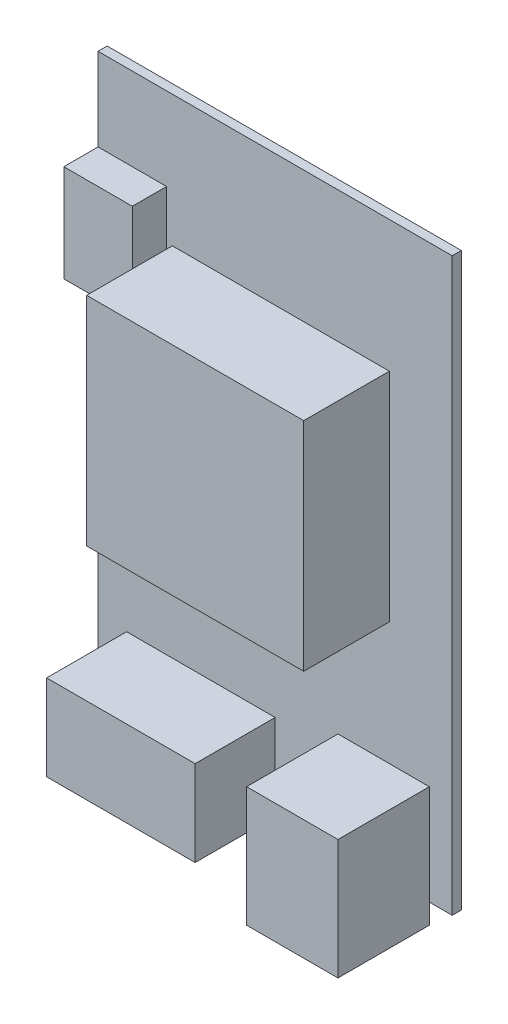
ISO-10303-21;
HEADER;
FILE_DESCRIPTION(('STEP AP214'),'2;1');
FILE_NAME('part.step','',(''),(''),'','','');
FILE_SCHEMA(('AUTOMOTIVE_DESIGN { 1 0 10303 214 1 1 1 1 }'));
ENDSEC;
DATA;
#1=APPLICATION_CONTEXT('core data for automotive mechanical design processes');
#2=APPLICATION_PROTOCOL_DEFINITION('international standard','automotive_design',2000,#1);
#3=PRODUCT_CONTEXT('',#1,'mechanical');
#4=PRODUCT('Part','Part','',(#3));
#5=PRODUCT_RELATED_PRODUCT_CATEGORY('part','',(#4));
#6=PRODUCT_DEFINITION_FORMATION('','',#4);
#7=PRODUCT_DEFINITION_CONTEXT('part definition',#1,'design');
#8=PRODUCT_DEFINITION('design','',#6,#7);
#9=PRODUCT_DEFINITION_SHAPE('','',#8);
#10=(LENGTH_UNIT() NAMED_UNIT(*) SI_UNIT(.MILLI.,.METRE.));
#11=(NAMED_UNIT(*) PLANE_ANGLE_UNIT() SI_UNIT($,.RADIAN.));
#12=(NAMED_UNIT(*) SI_UNIT($,.STERADIAN.) SOLID_ANGLE_UNIT());
#13=UNCERTAINTY_MEASURE_WITH_UNIT(LENGTH_MEASURE(1.E-05),#10,'distance_accuracy_value','');
#14=(GEOMETRIC_REPRESENTATION_CONTEXT(3) GLOBAL_UNCERTAINTY_ASSIGNED_CONTEXT((#13)) GLOBAL_UNIT_ASSIGNED_CONTEXT((#10,
#11,#12)) REPRESENTATION_CONTEXT('',''));
#15=CARTESIAN_POINT('',(0.,0.,0.));
#16=DIRECTION('',(0.,0.,1.));
#17=DIRECTION('',(1.,0.,0.));
#18=AXIS2_PLACEMENT_3D('',#15,#16,#17);
#19=CARTESIAN_POINT('',(0.,0.,1.6));
#20=DIRECTION('',(0.,0.,1.));
#21=DIRECTION('',(1.,0.,0.));
#22=AXIS2_PLACEMENT_3D('',#19,#20,#21);
#23=PLANE('',#22);
#24=DIRECTION('',(0.,1.,0.));
#25=VECTOR('',#24,1.);
#26=CARTESIAN_POINT('',(-19.,18.5,1.6));
#27=LINE('',#26,#25);
#28=CARTESIAN_POINT('',(-19.,18.5,1.6));
#29=VERTEX_POINT('',#28);
#30=CARTESIAN_POINT('',(-19.,35.5,1.6));
#31=VERTEX_POINT('',#30);
#32=EDGE_CURVE('E64',#29,#31,#27,.T.);
#33=ORIENTED_EDGE('',*,*,#32,.F.);
#34=DIRECTION('',(1.,0.,0.));
#35=VECTOR('',#34,1.);
#36=CARTESIAN_POINT('',(-31.,18.5,1.6));
#37=LINE('',#36,#35);
#38=CARTESIAN_POINT('',(-31.,18.5,1.6));
#39=VERTEX_POINT('',#38);
#40=EDGE_CURVE('E216',#39,#29,#37,.T.);
#41=ORIENTED_EDGE('',*,*,#40,.F.);
#42=DIRECTION('',(0.,-1.,0.));
#43=VECTOR('',#42,1.);
#44=CARTESIAN_POINT('',(-31.,50.,1.6));
#45=LINE('',#44,#43);
#46=CARTESIAN_POINT('',(-31.,-50.,1.6));
#47=VERTEX_POINT('',#46);
#48=EDGE_CURVE('E315',#39,#47,#45,.T.);
#49=ORIENTED_EDGE('',*,*,#48,.T.);
#50=DIRECTION('',(1.,0.,0.));
#51=VECTOR('',#50,1.);
#52=CARTESIAN_POINT('',(-31.,-50.,1.6));
#53=LINE('',#52,#51);
#54=CARTESIAN_POINT('',(-26.,-50.,1.6));
#55=VERTEX_POINT('',#54);
#56=EDGE_CURVE('E316',#47,#55,#53,.T.);
#57=ORIENTED_EDGE('',*,*,#56,.T.);
#58=DIRECTION('',(0.,-1.,0.));
#59=VECTOR('',#58,1.);
#60=CARTESIAN_POINT('',(-26.,-35.5,1.6));
#61=LINE('',#60,#59);
#62=CARTESIAN_POINT('',(-26.,-35.5,1.6));
#63=VERTEX_POINT('',#62);
#64=EDGE_CURVE('E259',#63,#55,#61,.T.);
#65=ORIENTED_EDGE('',*,*,#64,.F.);
#66=DIRECTION('',(-1.,0.,0.));
#67=VECTOR('',#66,1.);
#68=CARTESIAN_POINT('',(0.,-35.5,1.6));
#69=LINE('',#68,#67);
#70=CARTESIAN_POINT('',(0.,-35.5,1.6));
#71=VERTEX_POINT('',#70);
#72=EDGE_CURVE('E252',#71,#63,#69,.T.);
#73=ORIENTED_EDGE('',*,*,#72,.F.);
#74=DIRECTION('',(0.,-1.,0.));
#75=VECTOR('',#74,1.);
#76=CARTESIAN_POINT('',(0.,0.,1.6));
#77=LINE('',#76,#75);
#78=CARTESIAN_POINT('',(0.,-50.,1.6));
#79=VERTEX_POINT('',#78);
#80=EDGE_CURVE('E11',#71,#79,#77,.T.);
#81=ORIENTED_EDGE('',*,*,#80,.T.);
#82=CARTESIAN_POINT('',(11.,-50.,1.6));
#83=VERTEX_POINT('',#82);
#84=EDGE_CURVE('E321',#79,#83,#53,.T.);
#85=ORIENTED_EDGE('',*,*,#84,.T.);
#86=DIRECTION('',(0.,-1.,0.));
#87=VECTOR('',#86,1.);
#88=CARTESIAN_POINT('',(11.,-32.5,1.6));
#89=LINE('',#88,#87);
#90=CARTESIAN_POINT('',(11.,-32.5,1.6));
#91=VERTEX_POINT('',#90);
#92=EDGE_CURVE('E290',#91,#83,#89,.T.);
#93=ORIENTED_EDGE('',*,*,#92,.F.);
#94=DIRECTION('',(-1.,0.,0.));
#95=VECTOR('',#94,1.);
#96=CARTESIAN_POINT('',(27.,-32.5,1.6));
#97=LINE('',#96,#95);
#98=CARTESIAN_POINT('',(27.,-32.5,1.6));
#99=VERTEX_POINT('',#98);
#100=EDGE_CURVE('E283',#99,#91,#97,.T.);
#101=ORIENTED_EDGE('',*,*,#100,.F.);
#102=DIRECTION('',(0.,1.,0.));
#103=VECTOR('',#102,1.);
#104=CARTESIAN_POINT('',(27.,-53.5,1.6));
#105=LINE('',#104,#103);
#106=CARTESIAN_POINT('',(27.,-50.,1.6));
#107=VERTEX_POINT('',#106);
#108=EDGE_CURVE('E49',#107,#99,#105,.T.);
#109=ORIENTED_EDGE('',*,*,#108,.F.);
#110=CARTESIAN_POINT('',(31.,-50.,1.6));
#111=VERTEX_POINT('',#110);
#112=EDGE_CURVE('E314',#107,#111,#53,.T.);
#113=ORIENTED_EDGE('',*,*,#112,.T.);
#114=DIRECTION('',(0.,1.,0.));
#115=VECTOR('',#114,1.);
#116=CARTESIAN_POINT('',(31.,-50.,1.6));
#117=LINE('',#116,#115);
#118=CARTESIAN_POINT('',(31.,50.,1.6));
#119=VERTEX_POINT('',#118);
#120=EDGE_CURVE('E319',#111,#119,#117,.T.);
#121=ORIENTED_EDGE('',*,*,#120,.T.);
#122=DIRECTION('',(-1.,0.,0.));
#123=VECTOR('',#122,1.);
#124=CARTESIAN_POINT('',(31.,50.,1.6));
#125=LINE('',#124,#123);
#126=CARTESIAN_POINT('',(-31.,50.,1.6));
#127=VERTEX_POINT('',#126);
#128=EDGE_CURVE('E324',#119,#127,#125,.T.);
#129=ORIENTED_EDGE('',*,*,#128,.T.);
#130=CARTESIAN_POINT('',(-31.,35.5,1.6));
#131=VERTEX_POINT('',#130);
#132=EDGE_CURVE('E312',#127,#131,#45,.T.);
#133=ORIENTED_EDGE('',*,*,#132,.T.);
#134=DIRECTION('',(-1.,0.,0.));
#135=VECTOR('',#134,1.);
#136=CARTESIAN_POINT('',(-19.,35.5,1.6));
#137=LINE('',#136,#135);
#138=EDGE_CURVE('E226',#31,#131,#137,.T.);
#139=ORIENTED_EDGE('',*,*,#138,.F.);
#140=EDGE_LOOP('',(#33,#41,#49,#57,#65,#73,#81,#85,#93,#101,#109,#113,#121,#129,#133,#139));
#141=FACE_BOUND('',#140,.T.);
#142=DIRECTION('',(1.,0.,0.));
#143=VECTOR('',#142,1.);
#144=CARTESIAN_POINT('',(-18.,-11.,1.6));
#145=LINE('',#144,#143);
#146=CARTESIAN_POINT('',(-18.,-11.,1.6));
#147=VERTEX_POINT('',#146);
#148=CARTESIAN_POINT('',(20.,-11.,1.6));
#149=VERTEX_POINT('',#148);
#150=EDGE_CURVE('E710',#147,#149,#145,.T.);
#151=ORIENTED_EDGE('',*,*,#150,.F.);
#152=DIRECTION('',(0.,-1.,0.));
#153=VECTOR('',#152,1.);
#154=CARTESIAN_POINT('',(-18.,27.,1.6));
#155=LINE('',#154,#153);
#156=CARTESIAN_POINT('',(-18.,27.,1.6));
#157=VERTEX_POINT('',#156);
#158=EDGE_CURVE('E214',#157,#147,#155,.T.);
#159=ORIENTED_EDGE('',*,*,#158,.F.);
#160=DIRECTION('',(-1.,0.,0.));
#161=VECTOR('',#160,1.);
#162=CARTESIAN_POINT('',(20.,27.,1.6));
#163=LINE('',#162,#161);
#164=CARTESIAN_POINT('',(20.,27.,1.6));
#165=VERTEX_POINT('',#164);
#166=EDGE_CURVE('E210',#165,#157,#163,.T.);
#167=ORIENTED_EDGE('',*,*,#166,.F.);
#168=DIRECTION('',(0.,1.,0.));
#169=VECTOR('',#168,1.);
#170=CARTESIAN_POINT('',(20.,-11.,1.6));
#171=LINE('',#170,#169);
#172=EDGE_CURVE('E707',#149,#165,#171,.T.);
#173=ORIENTED_EDGE('',*,*,#172,.F.);
#174=EDGE_LOOP('',(#151,#159,#167,#173));
#175=FACE_BOUND('',#174,.T.);
#176=ADVANCED_FACE('F41',(#141,#175),#23,.T.);
#177=CARTESIAN_POINT('',(-31.,50.,1.6));
#178=DIRECTION('',(1.,0.,0.));
#179=DIRECTION('',(0.,0.,-1.));
#180=AXIS2_PLACEMENT_3D('',#177,#178,#179);
#181=PLANE('',#180);
#182=DIRECTION('',(0.,-1.,0.));
#183=VECTOR('',#182,1.);
#184=CARTESIAN_POINT('',(-31.,50.,0.));
#185=LINE('',#184,#183);
#186=CARTESIAN_POINT('',(-31.,50.,0.));
#187=VERTEX_POINT('',#186);
#188=CARTESIAN_POINT('',(-31.,-50.,0.));
#189=VERTEX_POINT('',#188);
#190=EDGE_CURVE('E311',#187,#189,#185,.T.);
#191=ORIENTED_EDGE('',*,*,#190,.T.);
#192=DIRECTION('',(0.,0.,-1.));
#193=VECTOR('',#192,1.);
#194=CARTESIAN_POINT('',(-31.,-50.,1.6));
#195=LINE('',#194,#193);
#196=EDGE_CURVE('E342',#47,#189,#195,.T.);
#197=ORIENTED_EDGE('',*,*,#196,.F.);
#198=ORIENTED_EDGE('',*,*,#48,.F.);
#199=DIRECTION('',(0.,0.,-1.));
#200=VECTOR('',#199,1.);
#201=CARTESIAN_POINT('',(-31.,18.5,7.6));
#202=LINE('',#201,#200);
#203=CARTESIAN_POINT('',(-31.,18.5,7.6));
#204=VERTEX_POINT('',#203);
#205=EDGE_CURVE('E244',#204,#39,#202,.T.);
#206=ORIENTED_EDGE('',*,*,#205,.F.);
#207=DIRECTION('',(0.,-1.,0.));
#208=VECTOR('',#207,1.);
#209=CARTESIAN_POINT('',(-31.,35.5,7.6));
#210=LINE('',#209,#208);
#211=CARTESIAN_POINT('',(-31.,35.5,7.6));
#212=VERTEX_POINT('',#211);
#213=EDGE_CURVE('E222',#212,#204,#210,.T.);
#214=ORIENTED_EDGE('',*,*,#213,.F.);
#215=DIRECTION('',(0.,0.,-1.));
#216=VECTOR('',#215,1.);
#217=CARTESIAN_POINT('',(-31.,35.5,7.6));
#218=LINE('',#217,#216);
#219=EDGE_CURVE('E231',#212,#131,#218,.T.);
#220=ORIENTED_EDGE('',*,*,#219,.T.);
#221=ORIENTED_EDGE('',*,*,#132,.F.);
#222=DIRECTION('',(0.,0.,-1.));
#223=VECTOR('',#222,1.);
#224=CARTESIAN_POINT('',(-31.,50.,1.6));
#225=LINE('',#224,#223);
#226=EDGE_CURVE('E326',#127,#187,#225,.T.);
#227=ORIENTED_EDGE('',*,*,#226,.T.);
#228=EDGE_LOOP('',(#191,#197,#198,#206,#214,#220,#221,#227));
#229=FACE_BOUND('',#228,.T.);
#230=ADVANCED_FACE('F43',(#229),#181,.F.);
#231=CARTESIAN_POINT('',(-31.,-50.,1.6));
#232=DIRECTION('',(0.,1.,0.));
#233=DIRECTION('',(0.,0.,1.));
#234=AXIS2_PLACEMENT_3D('',#231,#232,#233);
#235=PLANE('',#234);
#236=DIRECTION('',(1.,0.,0.));
#237=VECTOR('',#236,1.);
#238=CARTESIAN_POINT('',(-31.,-50.,0.));
#239=LINE('',#238,#237);
#240=CARTESIAN_POINT('',(31.,-50.,0.));
#241=VERTEX_POINT('',#240);
#242=EDGE_CURVE('E329',#189,#241,#239,.T.);
#243=ORIENTED_EDGE('',*,*,#242,.T.);
#244=DIRECTION('',(0.,0.,-1.));
#245=VECTOR('',#244,1.);
#246=CARTESIAN_POINT('',(31.,-50.,1.6));
#247=LINE('',#246,#245);
#248=EDGE_CURVE('E340',#111,#241,#247,.T.);
#249=ORIENTED_EDGE('',*,*,#248,.F.);
#250=ORIENTED_EDGE('',*,*,#112,.F.);
#251=EDGE_CURVE('E322',#83,#107,#53,.T.);
#252=ORIENTED_EDGE('',*,*,#251,.F.);
#253=ORIENTED_EDGE('',*,*,#84,.F.);
#254=EDGE_CURVE('E320',#55,#79,#53,.T.);
#255=ORIENTED_EDGE('',*,*,#254,.F.);
#256=ORIENTED_EDGE('',*,*,#56,.F.);
#257=ORIENTED_EDGE('',*,*,#196,.T.);
#258=EDGE_LOOP('',(#243,#249,#250,#252,#253,#255,#256,#257));
#259=FACE_BOUND('',#258,.T.);
#260=ADVANCED_FACE('F386',(#259),#235,.F.);
#261=CARTESIAN_POINT('',(31.,-50.,1.6));
#262=DIRECTION('',(-1.,0.,0.));
#263=DIRECTION('',(0.,0.,1.));
#264=AXIS2_PLACEMENT_3D('',#261,#262,#263);
#265=PLANE('',#264);
#266=DIRECTION('',(0.,1.,0.));
#267=VECTOR('',#266,1.);
#268=CARTESIAN_POINT('',(31.,-50.,0.));
#269=LINE('',#268,#267);
#270=CARTESIAN_POINT('',(31.,50.,0.));
#271=VERTEX_POINT('',#270);
#272=EDGE_CURVE('E331',#241,#271,#269,.T.);
#273=ORIENTED_EDGE('',*,*,#272,.T.);
#274=DIRECTION('',(0.,0.,-1.));
#275=VECTOR('',#274,1.);
#276=CARTESIAN_POINT('',(31.,50.,1.6));
#277=LINE('',#276,#275);
#278=EDGE_CURVE('E337',#119,#271,#277,.T.);
#279=ORIENTED_EDGE('',*,*,#278,.F.);
#280=ORIENTED_EDGE('',*,*,#120,.F.);
#281=ORIENTED_EDGE('',*,*,#248,.T.);
#282=EDGE_LOOP('',(#273,#279,#280,#281));
#283=FACE_BOUND('',#282,.T.);
#284=ADVANCED_FACE('F388',(#283),#265,.F.);
#285=CARTESIAN_POINT('',(31.,50.,1.6));
#286=DIRECTION('',(0.,-1.,0.));
#287=DIRECTION('',(0.,0.,-1.));
#288=AXIS2_PLACEMENT_3D('',#285,#286,#287);
#289=PLANE('',#288);
#290=DIRECTION('',(-1.,0.,0.));
#291=VECTOR('',#290,1.);
#292=CARTESIAN_POINT('',(31.,50.,0.));
#293=LINE('',#292,#291);
#294=EDGE_CURVE('E333',#271,#187,#293,.T.);
#295=ORIENTED_EDGE('',*,*,#294,.T.);
#296=ORIENTED_EDGE('',*,*,#226,.F.);
#297=ORIENTED_EDGE('',*,*,#128,.F.);
#298=ORIENTED_EDGE('',*,*,#278,.T.);
#299=EDGE_LOOP('',(#295,#296,#297,#298));
#300=FACE_BOUND('',#299,.T.);
#301=ADVANCED_FACE('F393',(#300),#289,.F.);
#302=CARTESIAN_POINT('',(0.,0.,0.));
#303=DIRECTION('',(0.,0.,1.));
#304=DIRECTION('',(1.,0.,0.));
#305=AXIS2_PLACEMENT_3D('',#302,#303,#304);
#306=PLANE('',#305);
#307=ORIENTED_EDGE('',*,*,#190,.F.);
#308=ORIENTED_EDGE('',*,*,#294,.F.);
#309=ORIENTED_EDGE('',*,*,#272,.F.);
#310=ORIENTED_EDGE('',*,*,#242,.F.);
#311=EDGE_LOOP('',(#307,#308,#309,#310));
#312=FACE_BOUND('',#311,.T.);
#313=ADVANCED_FACE('F405',(#312),#306,.F.);
#314=CARTESIAN_POINT('',(0.,0.,1.6));
#315=DIRECTION('',(0.,0.,1.));
#316=DIRECTION('',(1.,0.,0.));
#317=AXIS2_PLACEMENT_3D('',#314,#315,#316);
#318=PLANE('',#317);
#319=CARTESIAN_POINT('',(11.,-53.5,1.6));
#320=VERTEX_POINT('',#319);
#321=EDGE_CURVE('E278',#83,#320,#89,.T.);
#322=ORIENTED_EDGE('',*,*,#321,.F.);
#323=ORIENTED_EDGE('',*,*,#251,.T.);
#324=CARTESIAN_POINT('',(27.,-53.5,1.6));
#325=VERTEX_POINT('',#324);
#326=EDGE_CURVE('E295',#325,#107,#105,.T.);
#327=ORIENTED_EDGE('',*,*,#326,.F.);
#328=DIRECTION('',(1.,0.,0.));
#329=VECTOR('',#328,1.);
#330=CARTESIAN_POINT('',(11.,-53.5,1.6));
#331=LINE('',#330,#329);
#332=EDGE_CURVE('E293',#320,#325,#331,.T.);
#333=ORIENTED_EDGE('',*,*,#332,.F.);
#334=EDGE_LOOP('',(#322,#323,#327,#333));
#335=FACE_BOUND('',#334,.T.);
#336=ADVANCED_FACE('F368',(#335),#318,.F.);
#337=CARTESIAN_POINT('',(11.,-32.5,17.6));
#338=DIRECTION('',(1.,0.,0.));
#339=DIRECTION('',(0.,0.,-1.));
#340=AXIS2_PLACEMENT_3D('',#337,#338,#339);
#341=PLANE('',#340);
#342=ORIENTED_EDGE('',*,*,#92,.T.);
#343=ORIENTED_EDGE('',*,*,#321,.T.);
#344=DIRECTION('',(0.,0.,-1.));
#345=VECTOR('',#344,1.);
#346=CARTESIAN_POINT('',(11.,-53.5,17.6));
#347=LINE('',#346,#345);
#348=CARTESIAN_POINT('',(11.,-53.5,17.6));
#349=VERTEX_POINT('',#348);
#350=EDGE_CURVE('E308',#349,#320,#347,.T.);
#351=ORIENTED_EDGE('',*,*,#350,.F.);
#352=DIRECTION('',(0.,-1.,0.));
#353=VECTOR('',#352,1.);
#354=CARTESIAN_POINT('',(11.,-32.5,17.6));
#355=LINE('',#354,#353);
#356=CARTESIAN_POINT('',(11.,-32.5,17.6));
#357=VERTEX_POINT('',#356);
#358=EDGE_CURVE('E279',#357,#349,#355,.T.);
#359=ORIENTED_EDGE('',*,*,#358,.F.);
#360=DIRECTION('',(0.,0.,-1.));
#361=VECTOR('',#360,1.);
#362=CARTESIAN_POINT('',(11.,-32.5,17.6));
#363=LINE('',#362,#361);
#364=EDGE_CURVE('E289',#357,#91,#363,.T.);
#365=ORIENTED_EDGE('',*,*,#364,.T.);
#366=EDGE_LOOP('',(#342,#343,#351,#359,#365));
#367=FACE_BOUND('',#366,.T.);
#368=ADVANCED_FACE('F403',(#367),#341,.F.);
#369=CARTESIAN_POINT('',(11.,-53.5,17.6));
#370=DIRECTION('',(0.,1.,0.));
#371=DIRECTION('',(0.,0.,1.));
#372=AXIS2_PLACEMENT_3D('',#369,#370,#371);
#373=PLANE('',#372);
#374=ORIENTED_EDGE('',*,*,#332,.T.);
#375=DIRECTION('',(0.,0.,-1.));
#376=VECTOR('',#375,1.);
#377=CARTESIAN_POINT('',(27.,-53.5,17.6));
#378=LINE('',#377,#376);
#379=CARTESIAN_POINT('',(27.,-53.5,17.6));
#380=VERTEX_POINT('',#379);
#381=EDGE_CURVE('E305',#380,#325,#378,.T.);
#382=ORIENTED_EDGE('',*,*,#381,.F.);
#383=DIRECTION('',(1.,0.,0.));
#384=VECTOR('',#383,1.);
#385=CARTESIAN_POINT('',(11.,-53.5,17.6));
#386=LINE('',#385,#384);
#387=EDGE_CURVE('E282',#349,#380,#386,.T.);
#388=ORIENTED_EDGE('',*,*,#387,.F.);
#389=ORIENTED_EDGE('',*,*,#350,.T.);
#390=EDGE_LOOP('',(#374,#382,#388,#389));
#391=FACE_BOUND('',#390,.T.);
#392=ADVANCED_FACE('F465',(#391),#373,.F.);
#393=CARTESIAN_POINT('',(27.,-53.5,17.6));
#394=DIRECTION('',(-1.,0.,0.));
#395=DIRECTION('',(0.,0.,1.));
#396=AXIS2_PLACEMENT_3D('',#393,#394,#395);
#397=PLANE('',#396);
#398=ORIENTED_EDGE('',*,*,#326,.T.);
#399=ORIENTED_EDGE('',*,*,#108,.T.);
#400=DIRECTION('',(0.,0.,-1.));
#401=VECTOR('',#400,1.);
#402=CARTESIAN_POINT('',(27.,-32.5,17.6));
#403=LINE('',#402,#401);
#404=CARTESIAN_POINT('',(27.,-32.5,17.6));
#405=VERTEX_POINT('',#404);
#406=EDGE_CURVE('E302',#405,#99,#403,.T.);
#407=ORIENTED_EDGE('',*,*,#406,.F.);
#408=DIRECTION('',(0.,1.,0.));
#409=VECTOR('',#408,1.);
#410=CARTESIAN_POINT('',(27.,-53.5,17.6));
#411=LINE('',#410,#409);
#412=EDGE_CURVE('E285',#380,#405,#411,.T.);
#413=ORIENTED_EDGE('',*,*,#412,.F.);
#414=ORIENTED_EDGE('',*,*,#381,.T.);
#415=EDGE_LOOP('',(#398,#399,#407,#413,#414));
#416=FACE_BOUND('',#415,.T.);
#417=ADVANCED_FACE('F350',(#416),#397,.F.);
#418=CARTESIAN_POINT('',(27.,-32.5,17.6));
#419=DIRECTION('',(0.,-1.,0.));
#420=DIRECTION('',(0.,0.,-1.));
#421=AXIS2_PLACEMENT_3D('',#418,#419,#420);
#422=PLANE('',#421);
#423=ORIENTED_EDGE('',*,*,#100,.T.);
#424=ORIENTED_EDGE('',*,*,#364,.F.);
#425=DIRECTION('',(-1.,0.,0.));
#426=VECTOR('',#425,1.);
#427=CARTESIAN_POINT('',(27.,-32.5,17.6));
#428=LINE('',#427,#426);
#429=EDGE_CURVE('E287',#405,#357,#428,.T.);
#430=ORIENTED_EDGE('',*,*,#429,.F.);
#431=ORIENTED_EDGE('',*,*,#406,.T.);
#432=EDGE_LOOP('',(#423,#424,#430,#431));
#433=FACE_BOUND('',#432,.T.);
#434=ADVANCED_FACE('F356',(#433),#422,.F.);
#435=CARTESIAN_POINT('',(0.,0.,17.6));
#436=DIRECTION('',(0.,0.,1.));
#437=DIRECTION('',(1.,0.,0.));
#438=AXIS2_PLACEMENT_3D('',#435,#436,#437);
#439=PLANE('',#438);
#440=ORIENTED_EDGE('',*,*,#358,.T.);
#441=ORIENTED_EDGE('',*,*,#387,.T.);
#442=ORIENTED_EDGE('',*,*,#412,.T.);
#443=ORIENTED_EDGE('',*,*,#429,.T.);
#444=EDGE_LOOP('',(#440,#441,#442,#443));
#445=FACE_BOUND('',#444,.T.);
#446=ADVANCED_FACE('F360',(#445),#439,.T.);
#447=CARTESIAN_POINT('',(0.,0.,1.6));
#448=DIRECTION('',(0.,0.,1.));
#449=DIRECTION('',(1.,0.,0.));
#450=AXIS2_PLACEMENT_3D('',#447,#448,#449);
#451=PLANE('',#450);
#452=CARTESIAN_POINT('',(-26.,-50.5,1.6));
#453=VERTEX_POINT('',#452);
#454=EDGE_CURVE('E247',#55,#453,#61,.T.);
#455=ORIENTED_EDGE('',*,*,#454,.F.);
#456=ORIENTED_EDGE('',*,*,#254,.T.);
#457=DIRECTION('',(0.,1.,0.));
#458=VECTOR('',#457,1.);
#459=CARTESIAN_POINT('',(0.,-50.5,1.6));
#460=LINE('',#459,#458);
#461=CARTESIAN_POINT('',(0.,-50.5,1.6));
#462=VERTEX_POINT('',#461);
#463=EDGE_CURVE('E264',#462,#79,#460,.T.);
#464=ORIENTED_EDGE('',*,*,#463,.F.);
#465=DIRECTION('',(1.,0.,0.));
#466=VECTOR('',#465,1.);
#467=CARTESIAN_POINT('',(-26.,-50.5,1.6));
#468=LINE('',#467,#466);
#469=EDGE_CURVE('E262',#453,#462,#468,.T.);
#470=ORIENTED_EDGE('',*,*,#469,.F.);
#471=EDGE_LOOP('',(#455,#456,#464,#470));
#472=FACE_BOUND('',#471,.T.);
#473=ADVANCED_FACE('F375',(#472),#451,.F.);
#474=CARTESIAN_POINT('',(-26.,-35.5,15.6));
#475=DIRECTION('',(1.,0.,0.));
#476=DIRECTION('',(0.,0.,-1.));
#477=AXIS2_PLACEMENT_3D('',#474,#475,#476);
#478=PLANE('',#477);
#479=ORIENTED_EDGE('',*,*,#64,.T.);
#480=ORIENTED_EDGE('',*,*,#454,.T.);
#481=DIRECTION('',(0.,0.,-1.));
#482=VECTOR('',#481,1.);
#483=CARTESIAN_POINT('',(-26.,-50.5,15.6));
#484=LINE('',#483,#482);
#485=CARTESIAN_POINT('',(-26.,-50.5,15.6));
#486=VERTEX_POINT('',#485);
#487=EDGE_CURVE('E275',#486,#453,#484,.T.);
#488=ORIENTED_EDGE('',*,*,#487,.F.);
#489=DIRECTION('',(0.,-1.,0.));
#490=VECTOR('',#489,1.);
#491=CARTESIAN_POINT('',(-26.,-35.5,15.6));
#492=LINE('',#491,#490);
#493=CARTESIAN_POINT('',(-26.,-35.5,15.6));
#494=VERTEX_POINT('',#493);
#495=EDGE_CURVE('E248',#494,#486,#492,.T.);
#496=ORIENTED_EDGE('',*,*,#495,.F.);
#497=DIRECTION('',(0.,0.,-1.));
#498=VECTOR('',#497,1.);
#499=CARTESIAN_POINT('',(-26.,-35.5,15.6));
#500=LINE('',#499,#498);
#501=EDGE_CURVE('E258',#494,#63,#500,.T.);
#502=ORIENTED_EDGE('',*,*,#501,.T.);
#503=EDGE_LOOP('',(#479,#480,#488,#496,#502));
#504=FACE_BOUND('',#503,.T.);
#505=ADVANCED_FACE('F437',(#504),#478,.F.);
#506=CARTESIAN_POINT('',(-26.,-50.5,15.6));
#507=DIRECTION('',(0.,1.,0.));
#508=DIRECTION('',(0.,0.,1.));
#509=AXIS2_PLACEMENT_3D('',#506,#507,#508);
#510=PLANE('',#509);
#511=ORIENTED_EDGE('',*,*,#469,.T.);
#512=DIRECTION('',(0.,0.,-1.));
#513=VECTOR('',#512,1.);
#514=CARTESIAN_POINT('',(0.,-50.5,15.6));
#515=LINE('',#514,#513);
#516=CARTESIAN_POINT('',(0.,-50.5,15.6));
#517=VERTEX_POINT('',#516);
#518=EDGE_CURVE('E272',#517,#462,#515,.T.);
#519=ORIENTED_EDGE('',*,*,#518,.F.);
#520=DIRECTION('',(1.,0.,0.));
#521=VECTOR('',#520,1.);
#522=CARTESIAN_POINT('',(-26.,-50.5,15.6));
#523=LINE('',#522,#521);
#524=EDGE_CURVE('E251',#486,#517,#523,.T.);
#525=ORIENTED_EDGE('',*,*,#524,.F.);
#526=ORIENTED_EDGE('',*,*,#487,.T.);
#527=EDGE_LOOP('',(#511,#519,#525,#526));
#528=FACE_BOUND('',#527,.T.);
#529=ADVANCED_FACE('F447',(#528),#510,.F.);
#530=CARTESIAN_POINT('',(0.,-50.5,15.6));
#531=DIRECTION('',(-1.,0.,0.));
#532=DIRECTION('',(0.,0.,1.));
#533=AXIS2_PLACEMENT_3D('',#530,#531,#532);
#534=PLANE('',#533);
#535=ORIENTED_EDGE('',*,*,#463,.T.);
#536=ORIENTED_EDGE('',*,*,#80,.F.);
#537=DIRECTION('',(0.,0.,-1.));
#538=VECTOR('',#537,1.);
#539=CARTESIAN_POINT('',(0.,-35.5,15.6));
#540=LINE('',#539,#538);
#541=CARTESIAN_POINT('',(0.,-35.5,15.6));
#542=VERTEX_POINT('',#541);
#543=EDGE_CURVE('E270',#542,#71,#540,.T.);
#544=ORIENTED_EDGE('',*,*,#543,.F.);
#545=DIRECTION('',(0.,1.,0.));
#546=VECTOR('',#545,1.);
#547=CARTESIAN_POINT('',(0.,-50.5,15.6));
#548=LINE('',#547,#546);
#549=EDGE_CURVE('E254',#517,#542,#548,.T.);
#550=ORIENTED_EDGE('',*,*,#549,.F.);
#551=ORIENTED_EDGE('',*,*,#518,.T.);
#552=EDGE_LOOP('',(#535,#536,#544,#550,#551));
#553=FACE_BOUND('',#552,.T.);
#554=ADVANCED_FACE('F379',(#553),#534,.F.);
#555=CARTESIAN_POINT('',(0.,-35.5,15.6));
#556=DIRECTION('',(0.,-1.,0.));
#557=DIRECTION('',(0.,0.,-1.));
#558=AXIS2_PLACEMENT_3D('',#555,#556,#557);
#559=PLANE('',#558);
#560=ORIENTED_EDGE('',*,*,#72,.T.);
#561=ORIENTED_EDGE('',*,*,#501,.F.);
#562=DIRECTION('',(-1.,0.,0.));
#563=VECTOR('',#562,1.);
#564=CARTESIAN_POINT('',(0.,-35.5,15.6));
#565=LINE('',#564,#563);
#566=EDGE_CURVE('E256',#542,#494,#565,.T.);
#567=ORIENTED_EDGE('',*,*,#566,.F.);
#568=ORIENTED_EDGE('',*,*,#543,.T.);
#569=EDGE_LOOP('',(#560,#561,#567,#568));
#570=FACE_BOUND('',#569,.T.);
#571=ADVANCED_FACE('F443',(#570),#559,.F.);
#572=CARTESIAN_POINT('',(0.,0.,15.6));
#573=DIRECTION('',(0.,0.,1.));
#574=DIRECTION('',(1.,0.,0.));
#575=AXIS2_PLACEMENT_3D('',#572,#573,#574);
#576=PLANE('',#575);
#577=ORIENTED_EDGE('',*,*,#495,.T.);
#578=ORIENTED_EDGE('',*,*,#524,.T.);
#579=ORIENTED_EDGE('',*,*,#549,.T.);
#580=ORIENTED_EDGE('',*,*,#566,.T.);
#581=EDGE_LOOP('',(#577,#578,#579,#580));
#582=FACE_BOUND('',#581,.T.);
#583=ADVANCED_FACE('F445',(#582),#576,.T.);
#584=CARTESIAN_POINT('',(-31.,18.5,7.6));
#585=DIRECTION('',(0.,1.,0.));
#586=DIRECTION('',(0.,0.,1.));
#587=AXIS2_PLACEMENT_3D('',#584,#585,#586);
#588=PLANE('',#587);
#589=ORIENTED_EDGE('',*,*,#40,.T.);
#590=DIRECTION('',(0.,0.,-1.));
#591=VECTOR('',#590,1.);
#592=CARTESIAN_POINT('',(-19.,18.5,7.6));
#593=LINE('',#592,#591);
#594=CARTESIAN_POINT('',(-19.,18.5,7.6));
#595=VERTEX_POINT('',#594);
#596=EDGE_CURVE('E241',#595,#29,#593,.T.);
#597=ORIENTED_EDGE('',*,*,#596,.F.);
#598=DIRECTION('',(1.,0.,0.));
#599=VECTOR('',#598,1.);
#600=CARTESIAN_POINT('',(-31.,18.5,7.6));
#601=LINE('',#600,#599);
#602=EDGE_CURVE('E225',#204,#595,#601,.T.);
#603=ORIENTED_EDGE('',*,*,#602,.F.);
#604=ORIENTED_EDGE('',*,*,#205,.T.);
#605=EDGE_LOOP('',(#589,#597,#603,#604));
#606=FACE_BOUND('',#605,.T.);
#607=ADVANCED_FACE('F435',(#606),#588,.F.);
#608=CARTESIAN_POINT('',(-19.,18.5,7.6));
#609=DIRECTION('',(-1.,0.,0.));
#610=DIRECTION('',(0.,0.,1.));
#611=AXIS2_PLACEMENT_3D('',#608,#609,#610);
#612=PLANE('',#611);
#613=ORIENTED_EDGE('',*,*,#32,.T.);
#614=DIRECTION('',(0.,0.,-1.));
#615=VECTOR('',#614,1.);
#616=CARTESIAN_POINT('',(-19.,35.5,7.6));
#617=LINE('',#616,#615);
#618=CARTESIAN_POINT('',(-19.,35.5,7.6));
#619=VERTEX_POINT('',#618);
#620=EDGE_CURVE('E238',#619,#31,#617,.T.);
#621=ORIENTED_EDGE('',*,*,#620,.F.);
#622=DIRECTION('',(0.,1.,0.));
#623=VECTOR('',#622,1.);
#624=CARTESIAN_POINT('',(-19.,18.5,7.6));
#625=LINE('',#624,#623);
#626=EDGE_CURVE('E228',#595,#619,#625,.T.);
#627=ORIENTED_EDGE('',*,*,#626,.F.);
#628=ORIENTED_EDGE('',*,*,#596,.T.);
#629=EDGE_LOOP('',(#613,#621,#627,#628));
#630=FACE_BOUND('',#629,.T.);
#631=ADVANCED_FACE('F433',(#630),#612,.F.);
#632=CARTESIAN_POINT('',(-19.,35.5,7.6));
#633=DIRECTION('',(0.,-1.,0.));
#634=DIRECTION('',(0.,0.,-1.));
#635=AXIS2_PLACEMENT_3D('',#632,#633,#634);
#636=PLANE('',#635);
#637=ORIENTED_EDGE('',*,*,#138,.T.);
#638=ORIENTED_EDGE('',*,*,#219,.F.);
#639=DIRECTION('',(-1.,0.,0.));
#640=VECTOR('',#639,1.);
#641=CARTESIAN_POINT('',(-19.,35.5,7.6));
#642=LINE('',#641,#640);
#643=EDGE_CURVE('E230',#619,#212,#642,.T.);
#644=ORIENTED_EDGE('',*,*,#643,.F.);
#645=ORIENTED_EDGE('',*,*,#620,.T.);
#646=EDGE_LOOP('',(#637,#638,#644,#645));
#647=FACE_BOUND('',#646,.T.);
#648=ADVANCED_FACE('F423',(#647),#636,.F.);
#649=CARTESIAN_POINT('',(0.,0.,7.6));
#650=DIRECTION('',(0.,0.,1.));
#651=DIRECTION('',(1.,0.,0.));
#652=AXIS2_PLACEMENT_3D('',#649,#650,#651);
#653=PLANE('',#652);
#654=ORIENTED_EDGE('',*,*,#213,.T.);
#655=ORIENTED_EDGE('',*,*,#602,.T.);
#656=ORIENTED_EDGE('',*,*,#626,.T.);
#657=ORIENTED_EDGE('',*,*,#643,.T.);
#658=EDGE_LOOP('',(#654,#655,#656,#657));
#659=FACE_BOUND('',#658,.T.);
#660=ADVANCED_FACE('F429',(#659),#653,.T.);
#661=CARTESIAN_POINT('',(-18.,27.,16.6));
#662=DIRECTION('',(1.,0.,0.));
#663=DIRECTION('',(0.,0.,-1.));
#664=AXIS2_PLACEMENT_3D('',#661,#662,#663);
#665=PLANE('',#664);
#666=ORIENTED_EDGE('',*,*,#158,.T.);
#667=DIRECTION('',(0.,0.,-1.));
#668=VECTOR('',#667,1.);
#669=CARTESIAN_POINT('',(-18.,-11.,16.6));
#670=LINE('',#669,#668);
#671=CARTESIAN_POINT('',(-18.,-11.,16.6));
#672=VERTEX_POINT('',#671);
#673=EDGE_CURVE('E195',#672,#147,#670,.T.);
#674=ORIENTED_EDGE('',*,*,#673,.F.);
#675=DIRECTION('',(0.,-1.,0.));
#676=VECTOR('',#675,1.);
#677=CARTESIAN_POINT('',(-18.,27.,16.6));
#678=LINE('',#677,#676);
#679=CARTESIAN_POINT('',(-18.,27.,16.6));
#680=VERTEX_POINT('',#679);
#681=EDGE_CURVE('E202',#680,#672,#678,.T.);
#682=ORIENTED_EDGE('',*,*,#681,.F.);
#683=DIRECTION('',(0.,0.,-1.));
#684=VECTOR('',#683,1.);
#685=CARTESIAN_POINT('',(-18.,27.,16.6));
#686=LINE('',#685,#684);
#687=EDGE_CURVE('E705',#680,#157,#686,.T.);
#688=ORIENTED_EDGE('',*,*,#687,.T.);
#689=EDGE_LOOP('',(#666,#674,#682,#688));
#690=FACE_BOUND('',#689,.T.);
#691=ADVANCED_FACE('F212',(#690),#665,.F.);
#692=CARTESIAN_POINT('',(-18.,-11.,16.6));
#693=DIRECTION('',(0.,1.,0.));
#694=DIRECTION('',(0.,0.,1.));
#695=AXIS2_PLACEMENT_3D('',#692,#693,#694);
#696=PLANE('',#695);
#697=ORIENTED_EDGE('',*,*,#150,.T.);
#698=DIRECTION('',(0.,0.,-1.));
#699=VECTOR('',#698,1.);
#700=CARTESIAN_POINT('',(20.,-11.,16.6));
#701=LINE('',#700,#699);
#702=CARTESIAN_POINT('',(20.,-11.,16.6));
#703=VERTEX_POINT('',#702);
#704=EDGE_CURVE('E198',#703,#149,#701,.T.);
#705=ORIENTED_EDGE('',*,*,#704,.F.);
#706=DIRECTION('',(1.,0.,0.));
#707=VECTOR('',#706,1.);
#708=CARTESIAN_POINT('',(-18.,-11.,16.6));
#709=LINE('',#708,#707);
#710=EDGE_CURVE('E191',#672,#703,#709,.T.);
#711=ORIENTED_EDGE('',*,*,#710,.F.);
#712=ORIENTED_EDGE('',*,*,#673,.T.);
#713=EDGE_LOOP('',(#697,#705,#711,#712));
#714=FACE_BOUND('',#713,.T.);
#715=ADVANCED_FACE('F193',(#714),#696,.F.);
#716=CARTESIAN_POINT('',(20.,-11.,16.6));
#717=DIRECTION('',(-1.,0.,0.));
#718=DIRECTION('',(0.,0.,1.));
#719=AXIS2_PLACEMENT_3D('',#716,#717,#718);
#720=PLANE('',#719);
#721=ORIENTED_EDGE('',*,*,#172,.T.);
#722=DIRECTION('',(0.,0.,-1.));
#723=VECTOR('',#722,1.);
#724=CARTESIAN_POINT('',(20.,27.,16.6));
#725=LINE('',#724,#723);
#726=CARTESIAN_POINT('',(20.,27.,16.6));
#727=VERTEX_POINT('',#726);
#728=EDGE_CURVE('E56',#727,#165,#725,.T.);
#729=ORIENTED_EDGE('',*,*,#728,.F.);
#730=DIRECTION('',(0.,1.,0.));
#731=VECTOR('',#730,1.);
#732=CARTESIAN_POINT('',(20.,-11.,16.6));
#733=LINE('',#732,#731);
#734=EDGE_CURVE('E201',#703,#727,#733,.T.);
#735=ORIENTED_EDGE('',*,*,#734,.F.);
#736=ORIENTED_EDGE('',*,*,#704,.T.);
#737=EDGE_LOOP('',(#721,#729,#735,#736));
#738=FACE_BOUND('',#737,.T.);
#739=ADVANCED_FACE('F580',(#738),#720,.F.);
#740=CARTESIAN_POINT('',(20.,27.,16.6));
#741=DIRECTION('',(0.,-1.,0.));
#742=DIRECTION('',(0.,0.,-1.));
#743=AXIS2_PLACEMENT_3D('',#740,#741,#742);
#744=PLANE('',#743);
#745=ORIENTED_EDGE('',*,*,#166,.T.);
#746=ORIENTED_EDGE('',*,*,#687,.F.);
#747=DIRECTION('',(-1.,0.,0.));
#748=VECTOR('',#747,1.);
#749=CARTESIAN_POINT('',(20.,27.,16.6));
#750=LINE('',#749,#748);
#751=EDGE_CURVE('E206',#727,#680,#750,.T.);
#752=ORIENTED_EDGE('',*,*,#751,.F.);
#753=ORIENTED_EDGE('',*,*,#728,.T.);
#754=EDGE_LOOP('',(#745,#746,#752,#753));
#755=FACE_BOUND('',#754,.T.);
#756=ADVANCED_FACE('F590',(#755),#744,.F.);
#757=CARTESIAN_POINT('',(0.,0.,16.6));
#758=DIRECTION('',(0.,0.,1.));
#759=DIRECTION('',(1.,0.,0.));
#760=AXIS2_PLACEMENT_3D('',#757,#758,#759);
#761=PLANE('',#760);
#762=ORIENTED_EDGE('',*,*,#681,.T.);
#763=ORIENTED_EDGE('',*,*,#710,.T.);
#764=ORIENTED_EDGE('',*,*,#734,.T.);
#765=ORIENTED_EDGE('',*,*,#751,.T.);
#766=EDGE_LOOP('',(#762,#763,#764,#765));
#767=FACE_BOUND('',#766,.T.);
#768=ADVANCED_FACE('F205',(#767),#761,.T.);
#769=CLOSED_SHELL('',(#176,#230,#260,#284,#301,#313,#336,#368,#392,#417,#434,#446,#473,#505,
#529,#554,#571,#583,#607,#631,#648,#660,#691,#715,#739,#756,#768));
#770=MANIFOLD_SOLID_BREP('B2',#769);
#771=ADVANCED_BREP_SHAPE_REPRESENTATION('',(#18,#770),#14);
#772=SHAPE_DEFINITION_REPRESENTATION(#9,#771);
ENDSEC;
END-ISO-10303-21;
